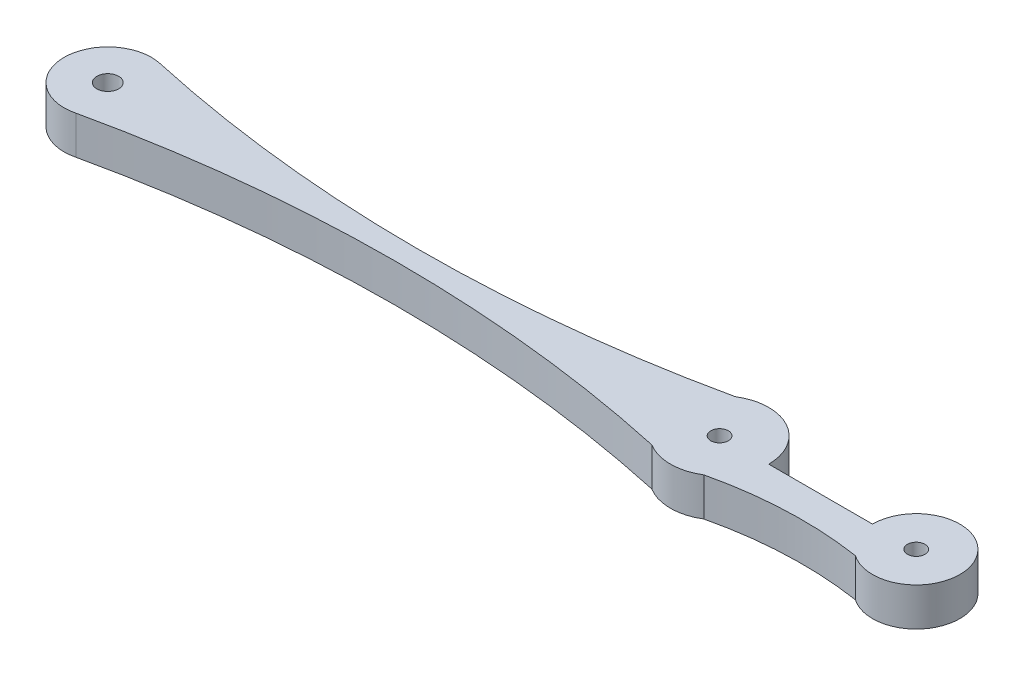
ISO-10303-21;
HEADER;
FILE_DESCRIPTION(('STEP AP214'),'2;1');
FILE_NAME('part.step','',(''),(''),'','','');
FILE_SCHEMA(('AUTOMOTIVE_DESIGN { 1 0 10303 214 1 1 1 1 }'));
ENDSEC;
DATA;
#1=APPLICATION_CONTEXT('core data for automotive mechanical design processes');
#2=APPLICATION_PROTOCOL_DEFINITION('international standard','automotive_design',2000,#1);
#3=PRODUCT_CONTEXT('',#1,'mechanical');
#4=PRODUCT('Part','Part','',(#3));
#5=PRODUCT_RELATED_PRODUCT_CATEGORY('part','',(#4));
#6=PRODUCT_DEFINITION_FORMATION('','',#4);
#7=PRODUCT_DEFINITION_CONTEXT('part definition',#1,'design');
#8=PRODUCT_DEFINITION('design','',#6,#7);
#9=PRODUCT_DEFINITION_SHAPE('','',#8);
#10=(LENGTH_UNIT() NAMED_UNIT(*) SI_UNIT(.MILLI.,.METRE.));
#11=(NAMED_UNIT(*) PLANE_ANGLE_UNIT() SI_UNIT($,.RADIAN.));
#12=(NAMED_UNIT(*) SI_UNIT($,.STERADIAN.) SOLID_ANGLE_UNIT());
#13=UNCERTAINTY_MEASURE_WITH_UNIT(LENGTH_MEASURE(1.E-05),#10,'distance_accuracy_value','');
#14=(GEOMETRIC_REPRESENTATION_CONTEXT(3) GLOBAL_UNCERTAINTY_ASSIGNED_CONTEXT((#13)) GLOBAL_UNIT_ASSIGNED_CONTEXT((#10,
#11,#12)) REPRESENTATION_CONTEXT('',''));
#15=CARTESIAN_POINT('',(0.,0.,0.));
#16=DIRECTION('',(0.,0.,1.));
#17=DIRECTION('',(1.,0.,0.));
#18=AXIS2_PLACEMENT_3D('',#15,#16,#17);
#19=CARTESIAN_POINT('',(-112.,7.,0.));
#20=DIRECTION('',(0.,-1.,0.));
#21=DIRECTION('',(0.,0.,-1.));
#22=AXIS2_PLACEMENT_3D('',#19,#20,#21);
#23=CYLINDRICAL_SURFACE('',#22,2.);
#24=CARTESIAN_POINT('',(-112.,7.,0.));
#25=DIRECTION('',(0.,1.,0.));
#26=DIRECTION('',(0.,0.,1.));
#27=AXIS2_PLACEMENT_3D('',#24,#25,#26);
#28=CIRCLE('',#27,2.);
#29=CARTESIAN_POINT('',(-112.,7.,2.));
#30=VERTEX_POINT('',#29);
#31=EDGE_CURVE('E220',#30,#30,#28,.T.);
#32=ORIENTED_EDGE('',*,*,#31,.T.);
#33=EDGE_LOOP('',(#32));
#34=FACE_BOUND('',#33,.T.);
#35=CARTESIAN_POINT('',(-112.,0.,0.));
#36=DIRECTION('',(0.,1.,0.));
#37=DIRECTION('',(0.,0.,1.));
#38=AXIS2_PLACEMENT_3D('',#35,#36,#37);
#39=CIRCLE('',#38,2.);
#40=CARTESIAN_POINT('',(-112.,0.,2.));
#41=VERTEX_POINT('',#40);
#42=EDGE_CURVE('E214',#41,#41,#39,.T.);
#43=ORIENTED_EDGE('',*,*,#42,.F.);
#44=EDGE_LOOP('',(#43));
#45=FACE_BOUND('',#44,.T.);
#46=ADVANCED_FACE('F71',(#34,#45),#23,.F.);
#47=CARTESIAN_POINT('',(-57.1309243363646,7.,-247.465647331307));
#48=DIRECTION('',(0.,-1.,0.));
#49=DIRECTION('',(0.,0.,-1.));
#50=AXIS2_PLACEMENT_3D('',#47,#48,#49);
#51=CYLINDRICAL_SURFACE('',#50,245.477674381375);
#52=CARTESIAN_POINT('',(-57.1309243363646,0.,-247.465647331307));
#53=DIRECTION('',(0.,1.,0.));
#54=DIRECTION('',(0.,0.,1.));
#55=AXIS2_PLACEMENT_3D('',#52,#53,#54);
#56=CIRCLE('',#55,245.477674381375);
#57=CARTESIAN_POINT('',(-110.092216301945,0.,-7.76919309590369));
#58=VERTEX_POINT('',#57);
#59=CARTESIAN_POINT('',(-4.75680380869347,0.,-7.64021056814531));
#60=VERTEX_POINT('',#59);
#61=EDGE_CURVE('E180',#58,#60,#56,.T.);
#62=ORIENTED_EDGE('',*,*,#61,.F.);
#63=DIRECTION('',(0.,-1.,0.));
#64=VECTOR('',#63,1.);
#65=CARTESIAN_POINT('',(-110.092216301945,7.,-7.76919309590369));
#66=LINE('',#65,#64);
#67=CARTESIAN_POINT('',(-110.092216301945,7.,-7.76919309590369));
#68=VERTEX_POINT('',#67);
#69=EDGE_CURVE('E82',#68,#58,#66,.T.);
#70=ORIENTED_EDGE('',*,*,#69,.F.);
#71=CARTESIAN_POINT('',(-57.1309243363646,7.,-247.465647331307));
#72=DIRECTION('',(0.,1.,0.));
#73=DIRECTION('',(0.,0.,1.));
#74=AXIS2_PLACEMENT_3D('',#71,#72,#73);
#75=CIRCLE('',#74,245.477674381375);
#76=CARTESIAN_POINT('',(-4.75680380869347,7.,-7.64021056814531));
#77=VERTEX_POINT('',#76);
#78=EDGE_CURVE('E210',#68,#77,#75,.T.);
#79=ORIENTED_EDGE('',*,*,#78,.T.);
#80=DIRECTION('',(0.,-1.,0.));
#81=VECTOR('',#80,1.);
#82=CARTESIAN_POINT('',(-4.75680380869347,7.,-7.64021056814531));
#83=LINE('',#82,#81);
#84=EDGE_CURVE('E12',#77,#60,#83,.T.);
#85=ORIENTED_EDGE('',*,*,#84,.T.);
#86=EDGE_LOOP('',(#62,#70,#79,#85));
#87=FACE_BOUND('',#86,.T.);
#88=ADVANCED_FACE('F266',(#87),#51,.F.);
#89=CARTESIAN_POINT('',(-112.,7.,0.));
#90=DIRECTION('',(0.,-1.,0.));
#91=DIRECTION('',(0.,0.,-1.));
#92=AXIS2_PLACEMENT_3D('',#89,#90,#91);
#93=CYLINDRICAL_SURFACE('',#92,8.00000000000001);
#94=CARTESIAN_POINT('',(-112.,0.,0.));
#95=DIRECTION('',(0.,1.,0.));
#96=DIRECTION('',(0.,0.,1.));
#97=AXIS2_PLACEMENT_3D('',#94,#95,#96);
#98=CIRCLE('',#97,8.00000000000001);
#99=CARTESIAN_POINT('',(-110.092216301945,0.,7.76919309590369));
#100=VERTEX_POINT('',#99);
#101=EDGE_CURVE('E226',#58,#100,#98,.T.);
#102=ORIENTED_EDGE('',*,*,#101,.T.);
#103=DIRECTION('',(0.,-1.,0.));
#104=VECTOR('',#103,1.);
#105=CARTESIAN_POINT('',(-110.092216301945,7.,7.76919309590369));
#106=LINE('',#105,#104);
#107=CARTESIAN_POINT('',(-110.092216301945,7.,7.76919309590369));
#108=VERTEX_POINT('',#107);
#109=EDGE_CURVE('E237',#108,#100,#106,.T.);
#110=ORIENTED_EDGE('',*,*,#109,.F.);
#111=CARTESIAN_POINT('',(-112.,7.,0.));
#112=DIRECTION('',(0.,1.,0.));
#113=DIRECTION('',(0.,0.,1.));
#114=AXIS2_PLACEMENT_3D('',#111,#112,#113);
#115=CIRCLE('',#114,8.00000000000001);
#116=EDGE_CURVE('E213',#68,#108,#115,.T.);
#117=ORIENTED_EDGE('',*,*,#116,.F.);
#118=ORIENTED_EDGE('',*,*,#69,.T.);
#119=EDGE_LOOP('',(#102,#110,#117,#118));
#120=FACE_BOUND('',#119,.T.);
#121=ADVANCED_FACE('F262',(#120),#93,.T.);
#122=CARTESIAN_POINT('',(-57.1309243363646,7.,247.465647331307));
#123=DIRECTION('',(0.,-1.,0.));
#124=DIRECTION('',(0.,0.,-1.));
#125=AXIS2_PLACEMENT_3D('',#122,#123,#124);
#126=CYLINDRICAL_SURFACE('',#125,245.477674381375);
#127=CARTESIAN_POINT('',(-57.1309243363646,0.,247.465647331307));
#128=DIRECTION('',(0.,1.,0.));
#129=DIRECTION('',(0.,0.,1.));
#130=AXIS2_PLACEMENT_3D('',#127,#128,#129);
#131=CIRCLE('',#130,245.477674381375);
#132=CARTESIAN_POINT('',(-4.75680380869347,0.,7.64021056814531));
#133=VERTEX_POINT('',#132);
#134=EDGE_CURVE('E229',#100,#133,#131,.F.);
#135=ORIENTED_EDGE('',*,*,#134,.T.);
#136=DIRECTION('',(0.,-1.,0.));
#137=VECTOR('',#136,1.);
#138=CARTESIAN_POINT('',(-4.75680380869347,7.,7.64021056814531));
#139=LINE('',#138,#137);
#140=CARTESIAN_POINT('',(-4.75680380869347,7.,7.64021056814531));
#141=VERTEX_POINT('',#140);
#142=EDGE_CURVE('E91',#141,#133,#139,.T.);
#143=ORIENTED_EDGE('',*,*,#142,.F.);
#144=CARTESIAN_POINT('',(-57.1309243363646,7.,247.465647331307));
#145=DIRECTION('',(0.,1.,0.));
#146=DIRECTION('',(0.,0.,1.));
#147=AXIS2_PLACEMENT_3D('',#144,#145,#146);
#148=CIRCLE('',#147,245.477674381375);
#149=EDGE_CURVE('E217',#108,#141,#148,.F.);
#150=ORIENTED_EDGE('',*,*,#149,.F.);
#151=ORIENTED_EDGE('',*,*,#109,.T.);
#152=EDGE_LOOP('',(#135,#143,#150,#151));
#153=FACE_BOUND('',#152,.T.);
#154=ADVANCED_FACE('F258',(#153),#126,.F.);
#155=CARTESIAN_POINT('',(0.,0.,0.));
#156=DIRECTION('',(0.,1.,0.));
#157=DIRECTION('',(0.,0.,1.));
#158=AXIS2_PLACEMENT_3D('',#155,#156,#157);
#159=PLANE('',#158);
#160=CARTESIAN_POINT('',(0.,0.,0.));
#161=DIRECTION('',(0.,1.,0.));
#162=DIRECTION('',(0.,0.,1.));
#163=AXIS2_PLACEMENT_3D('',#160,#161,#162);
#164=CIRCLE('',#163,1.6);
#165=CARTESIAN_POINT('',(0.,0.,1.6));
#166=VERTEX_POINT('',#165);
#167=EDGE_CURVE('E197',#166,#166,#164,.T.);
#168=ORIENTED_EDGE('',*,*,#167,.T.);
#169=EDGE_LOOP('',(#168));
#170=FACE_BOUND('',#169,.T.);
#171=ORIENTED_EDGE('',*,*,#61,.T.);
#172=CARTESIAN_POINT('',(0.,0.,0.));
#173=DIRECTION('',(0.,1.,0.));
#174=DIRECTION('',(0.,0.,1.));
#175=AXIS2_PLACEMENT_3D('',#172,#173,#174);
#176=CIRCLE('',#175,9.);
#177=CARTESIAN_POINT('',(9.,0.,0.));
#178=VERTEX_POINT('',#177);
#179=EDGE_CURVE('E75',#178,#60,#176,.T.);
#180=ORIENTED_EDGE('',*,*,#179,.F.);
#181=DIRECTION('',(1.,0.,0.));
#182=VECTOR('',#181,1.);
#183=CARTESIAN_POINT('',(0.,0.,0.));
#184=LINE('',#183,#182);
#185=CARTESIAN_POINT('',(28.,0.,0.));
#186=VERTEX_POINT('',#185);
#187=EDGE_CURVE('E141',#178,#186,#184,.T.);
#188=ORIENTED_EDGE('',*,*,#187,.T.);
#189=CARTESIAN_POINT('',(36.,0.,0.));
#190=DIRECTION('',(0.,1.,0.));
#191=DIRECTION('',(0.,0.,1.));
#192=AXIS2_PLACEMENT_3D('',#189,#190,#191);
#193=CIRCLE('',#192,8.);
#194=CARTESIAN_POINT('',(31.435202429975,0.,6.56982672105545));
#195=VERTEX_POINT('',#194);
#196=EDGE_CURVE('E132',#195,#186,#193,.T.);
#197=ORIENTED_EDGE('',*,*,#196,.F.);
#198=CARTESIAN_POINT('',(20.8573483672457,0.,75.9291787391784));
#199=DIRECTION('',(0.,1.,0.));
#200=DIRECTION('',(0.,0.,1.));
#201=AXIS2_PLACEMENT_3D('',#198,#199,#200);
#202=CIRCLE('',#201,70.1613191790626);
#203=CARTESIAN_POINT('',(4.75680380869351,0.,7.64021056814529));
#204=VERTEX_POINT('',#203);
#205=EDGE_CURVE('E154',#204,#195,#202,.F.);
#206=ORIENTED_EDGE('',*,*,#205,.F.);
#207=EDGE_CURVE('E193',#133,#204,#176,.T.);
#208=ORIENTED_EDGE('',*,*,#207,.F.);
#209=ORIENTED_EDGE('',*,*,#134,.F.);
#210=ORIENTED_EDGE('',*,*,#101,.F.);
#211=EDGE_LOOP('',(#171,#180,#188,#197,#206,#208,#209,#210));
#212=FACE_BOUND('',#211,.T.);
#213=ORIENTED_EDGE('',*,*,#42,.T.);
#214=EDGE_LOOP('',(#213));
#215=FACE_BOUND('',#214,.T.);
#216=CARTESIAN_POINT('',(36.,0.,0.));
#217=DIRECTION('',(0.,1.,0.));
#218=DIRECTION('',(0.,0.,1.));
#219=AXIS2_PLACEMENT_3D('',#216,#217,#218);
#220=CIRCLE('',#219,1.6);
#221=CARTESIAN_POINT('',(36.,0.,1.6));
#222=VERTEX_POINT('',#221);
#223=EDGE_CURVE('E162',#222,#222,#220,.T.);
#224=ORIENTED_EDGE('',*,*,#223,.T.);
#225=EDGE_LOOP('',(#224));
#226=FACE_BOUND('',#225,.T.);
#227=ADVANCED_FACE('F158',(#170,#212,#215,#226),#159,.F.);
#228=CARTESIAN_POINT('',(0.,7.,0.));
#229=DIRECTION('',(0.,1.,0.));
#230=DIRECTION('',(0.,0.,1.));
#231=AXIS2_PLACEMENT_3D('',#228,#229,#230);
#232=PLANE('',#231);
#233=CARTESIAN_POINT('',(0.,7.,0.));
#234=DIRECTION('',(0.,1.,0.));
#235=DIRECTION('',(0.,0.,1.));
#236=AXIS2_PLACEMENT_3D('',#233,#234,#235);
#237=CIRCLE('',#236,1.6);
#238=CARTESIAN_POINT('',(0.,7.,1.6));
#239=VERTEX_POINT('',#238);
#240=EDGE_CURVE('E202',#239,#239,#237,.T.);
#241=ORIENTED_EDGE('',*,*,#240,.F.);
#242=EDGE_LOOP('',(#241));
#243=FACE_BOUND('',#242,.T.);
#244=ORIENTED_EDGE('',*,*,#149,.T.);
#245=CARTESIAN_POINT('',(0.,7.,0.));
#246=DIRECTION('',(0.,1.,0.));
#247=DIRECTION('',(0.,0.,1.));
#248=AXIS2_PLACEMENT_3D('',#245,#246,#247);
#249=CIRCLE('',#248,9.);
#250=CARTESIAN_POINT('',(4.75680380869351,7.,7.64021056814529));
#251=VERTEX_POINT('',#250);
#252=EDGE_CURVE('E183',#141,#251,#249,.T.);
#253=ORIENTED_EDGE('',*,*,#252,.T.);
#254=CARTESIAN_POINT('',(20.8573483672457,7.,75.9291787391784));
#255=DIRECTION('',(0.,1.,0.));
#256=DIRECTION('',(0.,0.,1.));
#257=AXIS2_PLACEMENT_3D('',#254,#255,#256);
#258=CIRCLE('',#257,70.1613191790626);
#259=CARTESIAN_POINT('',(31.435202429975,7.,6.56982672105545));
#260=VERTEX_POINT('',#259);
#261=EDGE_CURVE('E248',#251,#260,#258,.F.);
#262=ORIENTED_EDGE('',*,*,#261,.T.);
#263=CARTESIAN_POINT('',(36.,7.,0.));
#264=DIRECTION('',(0.,1.,0.));
#265=DIRECTION('',(0.,0.,1.));
#266=AXIS2_PLACEMENT_3D('',#263,#264,#265);
#267=CIRCLE('',#266,8.);
#268=CARTESIAN_POINT('',(28.,7.,0.));
#269=VERTEX_POINT('',#268);
#270=EDGE_CURVE('E147',#260,#269,#267,.T.);
#271=ORIENTED_EDGE('',*,*,#270,.T.);
#272=DIRECTION('',(1.,0.,0.));
#273=VECTOR('',#272,1.);
#274=CARTESIAN_POINT('',(0.,7.,0.));
#275=LINE('',#274,#273);
#276=CARTESIAN_POINT('',(9.,7.,0.));
#277=VERTEX_POINT('',#276);
#278=EDGE_CURVE('E143',#277,#269,#275,.T.);
#279=ORIENTED_EDGE('',*,*,#278,.F.);
#280=EDGE_CURVE('E168',#277,#77,#249,.T.);
#281=ORIENTED_EDGE('',*,*,#280,.T.);
#282=ORIENTED_EDGE('',*,*,#78,.F.);
#283=ORIENTED_EDGE('',*,*,#116,.T.);
#284=EDGE_LOOP('',(#244,#253,#262,#271,#279,#281,#282,#283));
#285=FACE_BOUND('',#284,.T.);
#286=ORIENTED_EDGE('',*,*,#31,.F.);
#287=EDGE_LOOP('',(#286));
#288=FACE_BOUND('',#287,.T.);
#289=CARTESIAN_POINT('',(36.,7.,0.));
#290=DIRECTION('',(0.,1.,0.));
#291=DIRECTION('',(0.,0.,1.));
#292=AXIS2_PLACEMENT_3D('',#289,#290,#291);
#293=CIRCLE('',#292,1.6);
#294=CARTESIAN_POINT('',(36.,7.,1.6));
#295=VERTEX_POINT('',#294);
#296=EDGE_CURVE('E153',#295,#295,#293,.T.);
#297=ORIENTED_EDGE('',*,*,#296,.F.);
#298=EDGE_LOOP('',(#297));
#299=FACE_BOUND('',#298,.T.);
#300=ADVANCED_FACE('F251',(#243,#285,#288,#299),#232,.T.);
#301=CARTESIAN_POINT('',(36.,7.,0.));
#302=DIRECTION('',(0.,-1.,0.));
#303=DIRECTION('',(0.,0.,-1.));
#304=AXIS2_PLACEMENT_3D('',#301,#302,#303);
#305=CYLINDRICAL_SURFACE('',#304,8.);
#306=ORIENTED_EDGE('',*,*,#196,.T.);
#307=DIRECTION('',(0.,-1.,0.));
#308=VECTOR('',#307,1.);
#309=CARTESIAN_POINT('',(28.,7.,0.));
#310=LINE('',#309,#308);
#311=EDGE_CURVE('E139',#269,#186,#310,.T.);
#312=ORIENTED_EDGE('',*,*,#311,.F.);
#313=ORIENTED_EDGE('',*,*,#270,.F.);
#314=DIRECTION('',(0.,-1.,0.));
#315=VECTOR('',#314,1.);
#316=CARTESIAN_POINT('',(31.435202429975,7.,6.56982672105545));
#317=LINE('',#316,#315);
#318=EDGE_CURVE('E146',#260,#195,#317,.T.);
#319=ORIENTED_EDGE('',*,*,#318,.T.);
#320=EDGE_LOOP('',(#306,#312,#313,#319));
#321=FACE_BOUND('',#320,.T.);
#322=ADVANCED_FACE('F149',(#321),#305,.T.);
#323=CARTESIAN_POINT('',(36.,7.,0.));
#324=DIRECTION('',(0.,-1.,0.));
#325=DIRECTION('',(0.,0.,-1.));
#326=AXIS2_PLACEMENT_3D('',#323,#324,#325);
#327=CYLINDRICAL_SURFACE('',#326,1.6);
#328=ORIENTED_EDGE('',*,*,#296,.T.);
#329=EDGE_LOOP('',(#328));
#330=FACE_BOUND('',#329,.T.);
#331=ORIENTED_EDGE('',*,*,#223,.F.);
#332=EDGE_LOOP('',(#331));
#333=FACE_BOUND('',#332,.T.);
#334=ADVANCED_FACE('F271',(#330,#333),#327,.F.);
#335=CARTESIAN_POINT('',(0.,7.,0.));
#336=DIRECTION('',(0.,0.,-1.));
#337=DIRECTION('',(-1.,0.,0.));
#338=AXIS2_PLACEMENT_3D('',#335,#336,#337);
#339=PLANE('',#338);
#340=ORIENTED_EDGE('',*,*,#187,.F.);
#341=DIRECTION('',(0.,-1.,0.));
#342=VECTOR('',#341,1.);
#343=CARTESIAN_POINT('',(9.,7.,0.));
#344=LINE('',#343,#342);
#345=EDGE_CURVE('E178',#277,#178,#344,.T.);
#346=ORIENTED_EDGE('',*,*,#345,.F.);
#347=ORIENTED_EDGE('',*,*,#278,.T.);
#348=ORIENTED_EDGE('',*,*,#311,.T.);
#349=EDGE_LOOP('',(#340,#346,#347,#348));
#350=FACE_BOUND('',#349,.T.);
#351=ADVANCED_FACE('F140',(#350),#339,.T.);
#352=CARTESIAN_POINT('',(20.8573483672457,7.,75.9291787391784));
#353=DIRECTION('',(0.,-1.,0.));
#354=DIRECTION('',(0.,0.,-1.));
#355=AXIS2_PLACEMENT_3D('',#352,#353,#354);
#356=CYLINDRICAL_SURFACE('',#355,70.1613191790626);
#357=ORIENTED_EDGE('',*,*,#205,.T.);
#358=ORIENTED_EDGE('',*,*,#318,.F.);
#359=ORIENTED_EDGE('',*,*,#261,.F.);
#360=DIRECTION('',(0.,-1.,0.));
#361=VECTOR('',#360,1.);
#362=CARTESIAN_POINT('',(4.75680380869351,7.,7.64021056814529));
#363=LINE('',#362,#361);
#364=EDGE_CURVE('E174',#251,#204,#363,.T.);
#365=ORIENTED_EDGE('',*,*,#364,.T.);
#366=EDGE_LOOP('',(#357,#358,#359,#365));
#367=FACE_BOUND('',#366,.T.);
#368=ADVANCED_FACE('F255',(#367),#356,.F.);
#369=CARTESIAN_POINT('',(0.,7.,0.));
#370=DIRECTION('',(0.,-1.,0.));
#371=DIRECTION('',(0.,0.,-1.));
#372=AXIS2_PLACEMENT_3D('',#369,#370,#371);
#373=CYLINDRICAL_SURFACE('',#372,9.);
#374=ORIENTED_EDGE('',*,*,#84,.F.);
#375=ORIENTED_EDGE('',*,*,#280,.F.);
#376=ORIENTED_EDGE('',*,*,#345,.T.);
#377=ORIENTED_EDGE('',*,*,#179,.T.);
#378=EDGE_LOOP('',(#374,#375,#376,#377));
#379=FACE_BOUND('',#378,.T.);
#380=ADVANCED_FACE('F73',(#379),#373,.T.);
#381=ORIENTED_EDGE('',*,*,#252,.F.);
#382=ORIENTED_EDGE('',*,*,#142,.T.);
#383=ORIENTED_EDGE('',*,*,#207,.T.);
#384=ORIENTED_EDGE('',*,*,#364,.F.);
#385=EDGE_LOOP('',(#381,#382,#383,#384));
#386=FACE_BOUND('',#385,.T.);
#387=ADVANCED_FACE('F269',(#386),#373,.T.);
#388=CARTESIAN_POINT('',(0.,-3.,0.));
#389=DIRECTION('',(0.,1.,0.));
#390=DIRECTION('',(0.,0.,1.));
#391=AXIS2_PLACEMENT_3D('',#388,#389,#390);
#392=CYLINDRICAL_SURFACE('',#391,1.6);
#393=ORIENTED_EDGE('',*,*,#240,.T.);
#394=EDGE_LOOP('',(#393));
#395=FACE_BOUND('',#394,.T.);
#396=ORIENTED_EDGE('',*,*,#167,.F.);
#397=EDGE_LOOP('',(#396));
#398=FACE_BOUND('',#397,.T.);
#399=ADVANCED_FACE('F270',(#395,#398),#392,.F.);
#400=CLOSED_SHELL('',(#46,#88,#121,#154,#227,#300,#322,#334,#351,#368,#380,#387,#399));
#401=MANIFOLD_SOLID_BREP('B2',#400);
#402=ADVANCED_BREP_SHAPE_REPRESENTATION('',(#18,#401),#14);
#403=SHAPE_DEFINITION_REPRESENTATION(#9,#402);
ENDSEC;
END-ISO-10303-21;
